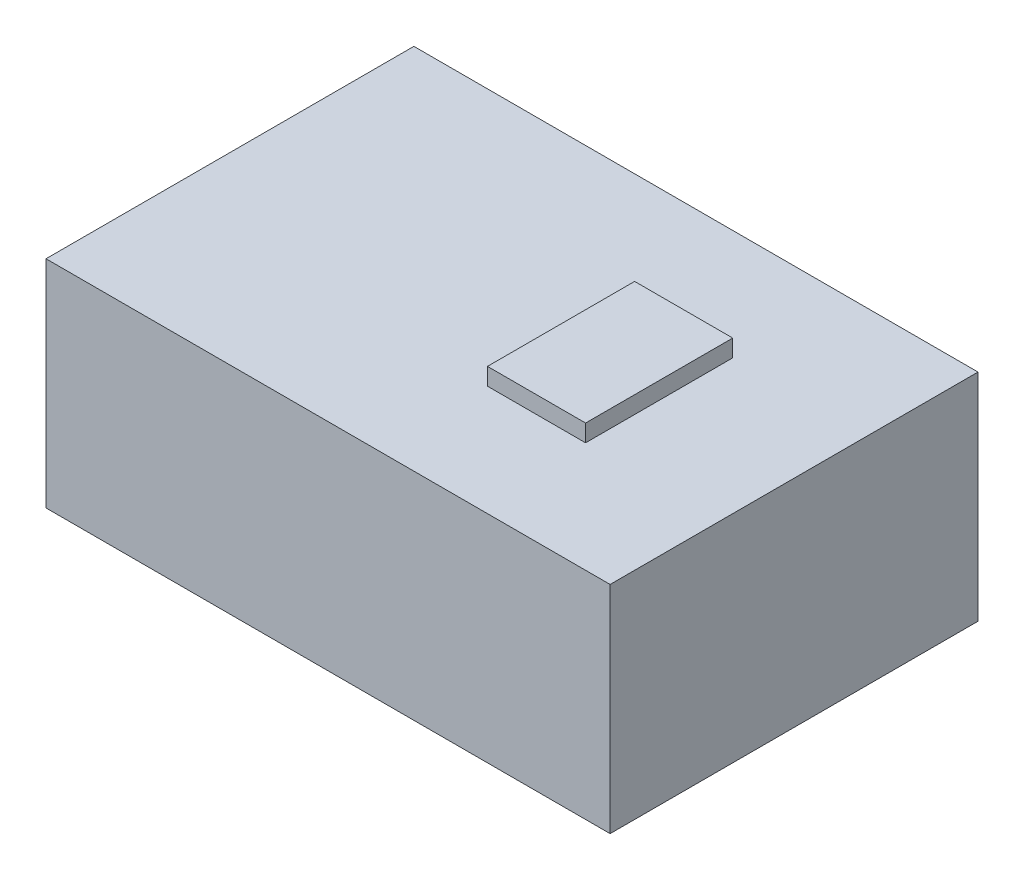
ISO-10303-21;
HEADER;
FILE_DESCRIPTION(('STEP AP214'),'2;1');
FILE_NAME('part.step','',(''),(''),'','','');
FILE_SCHEMA(('AUTOMOTIVE_DESIGN { 1 0 10303 214 1 1 1 1 }'));
ENDSEC;
DATA;
#1=APPLICATION_CONTEXT('core data for automotive mechanical design processes');
#2=APPLICATION_PROTOCOL_DEFINITION('international standard','automotive_design',2000,#1);
#3=PRODUCT_CONTEXT('',#1,'mechanical');
#4=PRODUCT('Part','Part','',(#3));
#5=PRODUCT_RELATED_PRODUCT_CATEGORY('part','',(#4));
#6=PRODUCT_DEFINITION_FORMATION('','',#4);
#7=PRODUCT_DEFINITION_CONTEXT('part definition',#1,'design');
#8=PRODUCT_DEFINITION('design','',#6,#7);
#9=PRODUCT_DEFINITION_SHAPE('','',#8);
#10=(LENGTH_UNIT() NAMED_UNIT(*) SI_UNIT(.MILLI.,.METRE.));
#11=(NAMED_UNIT(*) PLANE_ANGLE_UNIT() SI_UNIT($,.RADIAN.));
#12=(NAMED_UNIT(*) SI_UNIT($,.STERADIAN.) SOLID_ANGLE_UNIT());
#13=UNCERTAINTY_MEASURE_WITH_UNIT(LENGTH_MEASURE(1.E-05),#10,'distance_accuracy_value','');
#14=(GEOMETRIC_REPRESENTATION_CONTEXT(3) GLOBAL_UNCERTAINTY_ASSIGNED_CONTEXT((#13)) GLOBAL_UNIT_ASSIGNED_CONTEXT((#10,
#11,#12)) REPRESENTATION_CONTEXT('',''));
#15=CARTESIAN_POINT('',(0.,0.,0.));
#16=DIRECTION('',(0.,0.,1.));
#17=DIRECTION('',(1.,0.,0.));
#18=AXIS2_PLACEMENT_3D('',#15,#16,#17);
#19=CARTESIAN_POINT('',(-31.,-108.9,41.));
#20=DIRECTION('',(0.,-1.,0.));
#21=DIRECTION('',(0.,0.,-1.));
#22=AXIS2_PLACEMENT_3D('',#19,#20,#21);
#23=PLANE('',#22);
#24=DIRECTION('',(-1.,0.,0.));
#25=VECTOR('',#24,1.);
#26=CARTESIAN_POINT('',(-31.,-108.9,11.));
#27=LINE('',#26,#25);
#28=CARTESIAN_POINT('',(15.,-108.9,11.));
#29=VERTEX_POINT('',#28);
#30=CARTESIAN_POINT('',(-31.,-108.9,11.));
#31=VERTEX_POINT('',#30);
#32=EDGE_CURVE('E138',#29,#31,#27,.T.);
#33=ORIENTED_EDGE('',*,*,#32,.T.);
#34=DIRECTION('',(0.,0.,-1.));
#35=VECTOR('',#34,1.);
#36=CARTESIAN_POINT('',(-31.,-108.9,41.));
#37=LINE('',#36,#35);
#38=CARTESIAN_POINT('',(-31.,-108.9,41.));
#39=VERTEX_POINT('',#38);
#40=EDGE_CURVE('E47',#39,#31,#37,.T.);
#41=ORIENTED_EDGE('',*,*,#40,.F.);
#42=DIRECTION('',(-1.,0.,0.));
#43=VECTOR('',#42,1.);
#44=CARTESIAN_POINT('',(-31.,-108.9,41.));
#45=LINE('',#44,#43);
#46=CARTESIAN_POINT('',(15.,-108.9,41.));
#47=VERTEX_POINT('',#46);
#48=EDGE_CURVE('E91',#47,#39,#45,.T.);
#49=ORIENTED_EDGE('',*,*,#48,.F.);
#50=DIRECTION('',(0.,0.,-1.));
#51=VECTOR('',#50,1.);
#52=CARTESIAN_POINT('',(15.,-108.9,41.));
#53=LINE('',#52,#51);
#54=EDGE_CURVE('E11',#47,#29,#53,.T.);
#55=ORIENTED_EDGE('',*,*,#54,.T.);
#56=EDGE_LOOP('',(#33,#41,#49,#55));
#57=FACE_BOUND('',#56,.T.);
#58=DIRECTION('',(1.,0.,0.));
#59=VECTOR('',#58,1.);
#60=CARTESIAN_POINT('',(-4.,-108.9,32.));
#61=LINE('',#60,#59);
#62=CARTESIAN_POINT('',(-4.,-108.9,32.));
#63=VERTEX_POINT('',#62);
#64=CARTESIAN_POINT('',(4.,-108.9,32.));
#65=VERTEX_POINT('',#64);
#66=EDGE_CURVE('E129',#63,#65,#61,.T.);
#67=ORIENTED_EDGE('',*,*,#66,.F.);
#68=DIRECTION('',(0.,0.,-1.));
#69=VECTOR('',#68,1.);
#70=CARTESIAN_POINT('',(-4.,-108.9,32.));
#71=LINE('',#70,#69);
#72=CARTESIAN_POINT('',(-4.,-108.9,20.));
#73=VERTEX_POINT('',#72);
#74=EDGE_CURVE('E140',#63,#73,#71,.T.);
#75=ORIENTED_EDGE('',*,*,#74,.T.);
#76=DIRECTION('',(1.,0.,0.));
#77=VECTOR('',#76,1.);
#78=CARTESIAN_POINT('',(-4.,-108.9,20.));
#79=LINE('',#78,#77);
#80=CARTESIAN_POINT('',(4.,-108.9,20.));
#81=VERTEX_POINT('',#80);
#82=EDGE_CURVE('E132',#73,#81,#79,.T.);
#83=ORIENTED_EDGE('',*,*,#82,.T.);
#84=DIRECTION('',(0.,0.,-1.));
#85=VECTOR('',#84,1.);
#86=CARTESIAN_POINT('',(4.,-108.9,32.));
#87=LINE('',#86,#85);
#88=EDGE_CURVE('E188',#65,#81,#87,.T.);
#89=ORIENTED_EDGE('',*,*,#88,.F.);
#90=EDGE_LOOP('',(#67,#75,#83,#89));
#91=FACE_BOUND('',#90,.T.);
#92=ADVANCED_FACE('F39',(#57,#91),#23,.F.);
#93=CARTESIAN_POINT('',(15.,-126.5,41.));
#94=DIRECTION('',(-1.,0.,0.));
#95=DIRECTION('',(0.,0.,1.));
#96=AXIS2_PLACEMENT_3D('',#93,#94,#95);
#97=PLANE('',#96);
#98=DIRECTION('',(0.,1.,0.));
#99=VECTOR('',#98,1.);
#100=CARTESIAN_POINT('',(15.,-126.5,11.));
#101=LINE('',#100,#99);
#102=CARTESIAN_POINT('',(15.,-126.5,11.));
#103=VERTEX_POINT('',#102);
#104=EDGE_CURVE('E135',#103,#29,#101,.T.);
#105=ORIENTED_EDGE('',*,*,#104,.T.);
#106=ORIENTED_EDGE('',*,*,#54,.F.);
#107=DIRECTION('',(0.,1.,0.));
#108=VECTOR('',#107,1.);
#109=CARTESIAN_POINT('',(15.,-126.5,41.));
#110=LINE('',#109,#108);
#111=CARTESIAN_POINT('',(15.,-126.5,41.));
#112=VERTEX_POINT('',#111);
#113=EDGE_CURVE('E144',#112,#47,#110,.T.);
#114=ORIENTED_EDGE('',*,*,#113,.F.);
#115=DIRECTION('',(0.,0.,-1.));
#116=VECTOR('',#115,1.);
#117=CARTESIAN_POINT('',(15.,-126.5,41.));
#118=LINE('',#117,#116);
#119=EDGE_CURVE('E149',#112,#103,#118,.T.);
#120=ORIENTED_EDGE('',*,*,#119,.T.);
#121=EDGE_LOOP('',(#105,#106,#114,#120));
#122=FACE_BOUND('',#121,.T.);
#123=ADVANCED_FACE('F41',(#122),#97,.F.);
#124=CARTESIAN_POINT('',(-31.,-126.5,41.));
#125=DIRECTION('',(1.,0.,0.));
#126=DIRECTION('',(0.,0.,-1.));
#127=AXIS2_PLACEMENT_3D('',#124,#125,#126);
#128=PLANE('',#127);
#129=DIRECTION('',(0.,-1.,0.));
#130=VECTOR('',#129,1.);
#131=CARTESIAN_POINT('',(-31.,-126.5,11.));
#132=LINE('',#131,#130);
#133=CARTESIAN_POINT('',(-31.,-126.5,11.));
#134=VERTEX_POINT('',#133);
#135=EDGE_CURVE('E152',#31,#134,#132,.T.);
#136=ORIENTED_EDGE('',*,*,#135,.T.);
#137=DIRECTION('',(0.,0.,-1.));
#138=VECTOR('',#137,1.);
#139=CARTESIAN_POINT('',(-31.,-126.5,41.));
#140=LINE('',#139,#138);
#141=CARTESIAN_POINT('',(-31.,-126.5,41.));
#142=VERTEX_POINT('',#141);
#143=EDGE_CURVE('E156',#142,#134,#140,.T.);
#144=ORIENTED_EDGE('',*,*,#143,.F.);
#145=DIRECTION('',(0.,-1.,0.));
#146=VECTOR('',#145,1.);
#147=CARTESIAN_POINT('',(-31.,-126.5,41.));
#148=LINE('',#147,#146);
#149=EDGE_CURVE('E147',#39,#142,#148,.T.);
#150=ORIENTED_EDGE('',*,*,#149,.F.);
#151=ORIENTED_EDGE('',*,*,#40,.T.);
#152=EDGE_LOOP('',(#136,#144,#150,#151));
#153=FACE_BOUND('',#152,.T.);
#154=ADVANCED_FACE('F161',(#153),#128,.F.);
#155=CARTESIAN_POINT('',(-31.,-126.5,41.));
#156=DIRECTION('',(0.,1.,0.));
#157=DIRECTION('',(0.,0.,1.));
#158=AXIS2_PLACEMENT_3D('',#155,#156,#157);
#159=PLANE('',#158);
#160=DIRECTION('',(1.,0.,0.));
#161=VECTOR('',#160,1.);
#162=CARTESIAN_POINT('',(-31.,-126.5,11.));
#163=LINE('',#162,#161);
#164=EDGE_CURVE('E84',#134,#103,#163,.T.);
#165=ORIENTED_EDGE('',*,*,#164,.T.);
#166=ORIENTED_EDGE('',*,*,#119,.F.);
#167=DIRECTION('',(1.,0.,0.));
#168=VECTOR('',#167,1.);
#169=CARTESIAN_POINT('',(-31.,-126.5,41.));
#170=LINE('',#169,#168);
#171=EDGE_CURVE('E63',#142,#112,#170,.T.);
#172=ORIENTED_EDGE('',*,*,#171,.F.);
#173=ORIENTED_EDGE('',*,*,#143,.T.);
#174=EDGE_LOOP('',(#165,#166,#172,#173));
#175=FACE_BOUND('',#174,.T.);
#176=ADVANCED_FACE('F169',(#175),#159,.F.);
#177=CARTESIAN_POINT('',(0.,0.,41.));
#178=DIRECTION('',(0.,0.,-1.));
#179=DIRECTION('',(-1.,0.,0.));
#180=AXIS2_PLACEMENT_3D('',#177,#178,#179);
#181=PLANE('',#180);
#182=ORIENTED_EDGE('',*,*,#113,.T.);
#183=ORIENTED_EDGE('',*,*,#48,.T.);
#184=ORIENTED_EDGE('',*,*,#149,.T.);
#185=ORIENTED_EDGE('',*,*,#171,.T.);
#186=EDGE_LOOP('',(#182,#183,#184,#185));
#187=FACE_BOUND('',#186,.T.);
#188=ADVANCED_FACE('F171',(#187),#181,.F.);
#189=CARTESIAN_POINT('',(0.,0.,11.));
#190=DIRECTION('',(0.,0.,-1.));
#191=DIRECTION('',(-1.,0.,0.));
#192=AXIS2_PLACEMENT_3D('',#189,#190,#191);
#193=PLANE('',#192);
#194=ORIENTED_EDGE('',*,*,#104,.F.);
#195=ORIENTED_EDGE('',*,*,#164,.F.);
#196=ORIENTED_EDGE('',*,*,#135,.F.);
#197=ORIENTED_EDGE('',*,*,#32,.F.);
#198=EDGE_LOOP('',(#194,#195,#196,#197));
#199=FACE_BOUND('',#198,.T.);
#200=ADVANCED_FACE('F165',(#199),#193,.T.);
#201=CARTESIAN_POINT('',(4.,-108.9,32.));
#202=DIRECTION('',(-1.,0.,0.));
#203=DIRECTION('',(0.,0.,1.));
#204=AXIS2_PLACEMENT_3D('',#201,#202,#203);
#205=PLANE('',#204);
#206=DIRECTION('',(0.,1.,0.));
#207=VECTOR('',#206,1.);
#208=CARTESIAN_POINT('',(4.,-108.9,20.));
#209=LINE('',#208,#207);
#210=CARTESIAN_POINT('',(4.,-107.5,20.));
#211=VERTEX_POINT('',#210);
#212=EDGE_CURVE('E54',#81,#211,#209,.T.);
#213=ORIENTED_EDGE('',*,*,#212,.T.);
#214=DIRECTION('',(0.,0.,-1.));
#215=VECTOR('',#214,1.);
#216=CARTESIAN_POINT('',(4.,-107.5,32.));
#217=LINE('',#216,#215);
#218=CARTESIAN_POINT('',(4.,-107.5,32.));
#219=VERTEX_POINT('',#218);
#220=EDGE_CURVE('E118',#219,#211,#217,.T.);
#221=ORIENTED_EDGE('',*,*,#220,.F.);
#222=DIRECTION('',(0.,1.,0.));
#223=VECTOR('',#222,1.);
#224=CARTESIAN_POINT('',(4.,-108.9,32.));
#225=LINE('',#224,#223);
#226=EDGE_CURVE('E124',#65,#219,#225,.T.);
#227=ORIENTED_EDGE('',*,*,#226,.F.);
#228=ORIENTED_EDGE('',*,*,#88,.T.);
#229=EDGE_LOOP('',(#213,#221,#227,#228));
#230=FACE_BOUND('',#229,.T.);
#231=ADVANCED_FACE('F134',(#230),#205,.F.);
#232=CARTESIAN_POINT('',(-4.,-107.5,32.));
#233=DIRECTION('',(0.,-1.,0.));
#234=DIRECTION('',(0.,0.,-1.));
#235=AXIS2_PLACEMENT_3D('',#232,#233,#234);
#236=PLANE('',#235);
#237=DIRECTION('',(-1.,0.,0.));
#238=VECTOR('',#237,1.);
#239=CARTESIAN_POINT('',(-4.,-107.5,20.));
#240=LINE('',#239,#238);
#241=CARTESIAN_POINT('',(-4.,-107.5,20.));
#242=VERTEX_POINT('',#241);
#243=EDGE_CURVE('E194',#211,#242,#240,.T.);
#244=ORIENTED_EDGE('',*,*,#243,.T.);
#245=DIRECTION('',(0.,0.,-1.));
#246=VECTOR('',#245,1.);
#247=CARTESIAN_POINT('',(-4.,-107.5,32.));
#248=LINE('',#247,#246);
#249=CARTESIAN_POINT('',(-4.,-107.5,32.));
#250=VERTEX_POINT('',#249);
#251=EDGE_CURVE('E120',#250,#242,#248,.T.);
#252=ORIENTED_EDGE('',*,*,#251,.F.);
#253=DIRECTION('',(-1.,0.,0.));
#254=VECTOR('',#253,1.);
#255=CARTESIAN_POINT('',(-4.,-107.5,32.));
#256=LINE('',#255,#254);
#257=EDGE_CURVE('E114',#219,#250,#256,.T.);
#258=ORIENTED_EDGE('',*,*,#257,.F.);
#259=ORIENTED_EDGE('',*,*,#220,.T.);
#260=EDGE_LOOP('',(#244,#252,#258,#259));
#261=FACE_BOUND('',#260,.T.);
#262=ADVANCED_FACE('F116',(#261),#236,.F.);
#263=CARTESIAN_POINT('',(-4.,-108.9,32.));
#264=DIRECTION('',(1.,0.,0.));
#265=DIRECTION('',(0.,0.,-1.));
#266=AXIS2_PLACEMENT_3D('',#263,#264,#265);
#267=PLANE('',#266);
#268=DIRECTION('',(0.,-1.,0.));
#269=VECTOR('',#268,1.);
#270=CARTESIAN_POINT('',(-4.,-108.9,20.));
#271=LINE('',#270,#269);
#272=EDGE_CURVE('E196',#242,#73,#271,.T.);
#273=ORIENTED_EDGE('',*,*,#272,.T.);
#274=ORIENTED_EDGE('',*,*,#74,.F.);
#275=DIRECTION('',(0.,-1.,0.));
#276=VECTOR('',#275,1.);
#277=CARTESIAN_POINT('',(-4.,-108.9,32.));
#278=LINE('',#277,#276);
#279=EDGE_CURVE('E123',#250,#63,#278,.T.);
#280=ORIENTED_EDGE('',*,*,#279,.F.);
#281=ORIENTED_EDGE('',*,*,#251,.T.);
#282=EDGE_LOOP('',(#273,#274,#280,#281));
#283=FACE_BOUND('',#282,.T.);
#284=ADVANCED_FACE('F201',(#283),#267,.F.);
#285=CARTESIAN_POINT('',(0.,0.,32.));
#286=DIRECTION('',(0.,0.,-1.));
#287=DIRECTION('',(-1.,0.,0.));
#288=AXIS2_PLACEMENT_3D('',#285,#286,#287);
#289=PLANE('',#288);
#290=ORIENTED_EDGE('',*,*,#226,.T.);
#291=ORIENTED_EDGE('',*,*,#257,.T.);
#292=ORIENTED_EDGE('',*,*,#279,.T.);
#293=ORIENTED_EDGE('',*,*,#66,.T.);
#294=EDGE_LOOP('',(#290,#291,#292,#293));
#295=FACE_BOUND('',#294,.T.);
#296=ADVANCED_FACE('F127',(#295),#289,.F.);
#297=CARTESIAN_POINT('',(0.,0.,20.));
#298=DIRECTION('',(0.,0.,-1.));
#299=DIRECTION('',(-1.,0.,0.));
#300=AXIS2_PLACEMENT_3D('',#297,#298,#299);
#301=PLANE('',#300);
#302=ORIENTED_EDGE('',*,*,#212,.F.);
#303=ORIENTED_EDGE('',*,*,#82,.F.);
#304=ORIENTED_EDGE('',*,*,#272,.F.);
#305=ORIENTED_EDGE('',*,*,#243,.F.);
#306=EDGE_LOOP('',(#302,#303,#304,#305));
#307=FACE_BOUND('',#306,.T.);
#308=ADVANCED_FACE('F199',(#307),#301,.T.);
#309=CLOSED_SHELL('',(#92,#123,#154,#176,#188,#200,#231,#262,#284,#296,#308));
#310=MANIFOLD_SOLID_BREP('B2',#309);
#311=ADVANCED_BREP_SHAPE_REPRESENTATION('',(#18,#310),#14);
#312=SHAPE_DEFINITION_REPRESENTATION(#9,#311);
ENDSEC;
END-ISO-10303-21;
